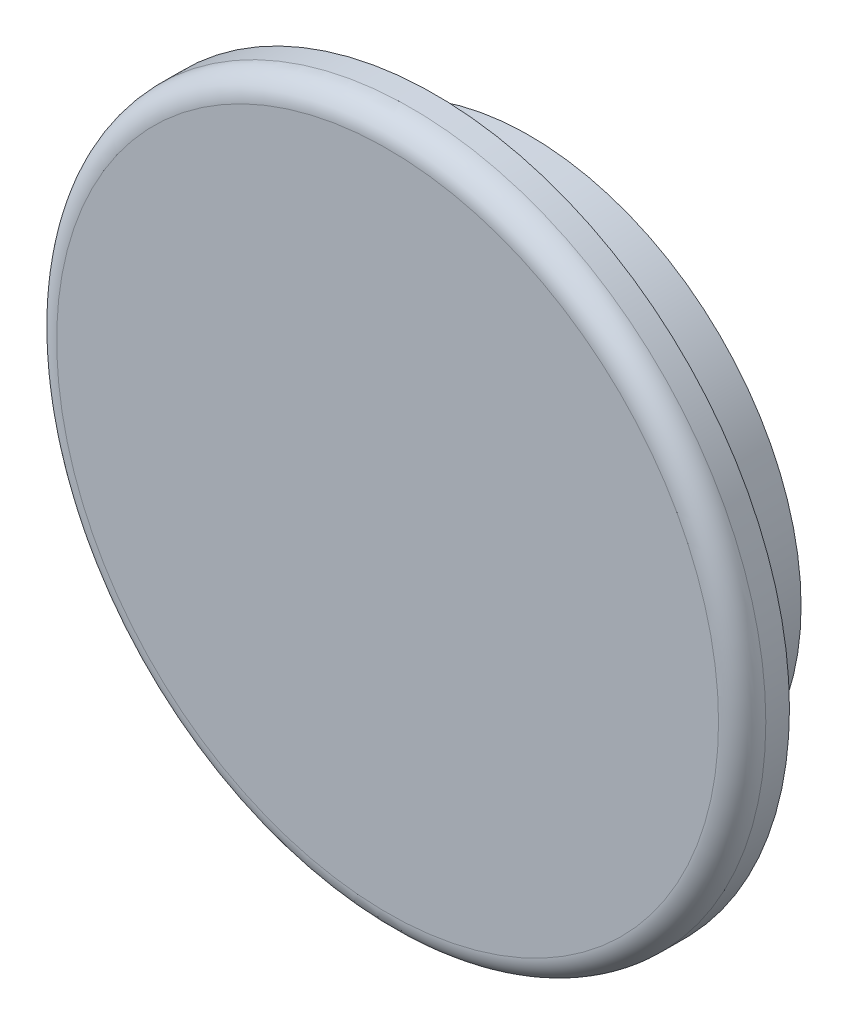
ISO-10303-21;
HEADER;
FILE_DESCRIPTION(('STEP AP214'),'2;1');
FILE_NAME('part.step','',(''),(''),'','','');
FILE_SCHEMA(('AUTOMOTIVE_DESIGN { 1 0 10303 214 1 1 1 1 }'));
ENDSEC;
DATA;
#1=APPLICATION_CONTEXT('core data for automotive mechanical design processes');
#2=APPLICATION_PROTOCOL_DEFINITION('international standard','automotive_design',2000,#1);
#3=PRODUCT_CONTEXT('',#1,'mechanical');
#4=PRODUCT('Part','Part','',(#3));
#5=PRODUCT_RELATED_PRODUCT_CATEGORY('part','',(#4));
#6=PRODUCT_DEFINITION_FORMATION('','',#4);
#7=PRODUCT_DEFINITION_CONTEXT('part definition',#1,'design');
#8=PRODUCT_DEFINITION('design','',#6,#7);
#9=PRODUCT_DEFINITION_SHAPE('','',#8);
#10=(LENGTH_UNIT() NAMED_UNIT(*) SI_UNIT(.MILLI.,.METRE.));
#11=(NAMED_UNIT(*) PLANE_ANGLE_UNIT() SI_UNIT($,.RADIAN.));
#12=(NAMED_UNIT(*) SI_UNIT($,.STERADIAN.) SOLID_ANGLE_UNIT());
#13=UNCERTAINTY_MEASURE_WITH_UNIT(LENGTH_MEASURE(1.E-05),#10,'distance_accuracy_value','');
#14=(GEOMETRIC_REPRESENTATION_CONTEXT(3) GLOBAL_UNCERTAINTY_ASSIGNED_CONTEXT((#13)) GLOBAL_UNIT_ASSIGNED_CONTEXT((#10,
#11,#12)) REPRESENTATION_CONTEXT('',''));
#15=CARTESIAN_POINT('',(0.,0.,0.));
#16=DIRECTION('',(0.,0.,1.));
#17=DIRECTION('',(1.,0.,0.));
#18=AXIS2_PLACEMENT_3D('',#15,#16,#17);
#19=CARTESIAN_POINT('',(0.,0.,2.));
#20=DIRECTION('',(0.,0.,-1.));
#21=DIRECTION('',(-1.,0.,0.));
#22=AXIS2_PLACEMENT_3D('',#19,#20,#21);
#23=CYLINDRICAL_SURFACE('',#22,5.746);
#24=CARTESIAN_POINT('',(0.,0.,2.));
#25=DIRECTION('',(0.,0.,1.));
#26=DIRECTION('',(1.,0.,0.));
#27=AXIS2_PLACEMENT_3D('',#24,#25,#26);
#28=CIRCLE('',#27,5.746);
#29=CARTESIAN_POINT('',(5.746,0.,2.));
#30=VERTEX_POINT('',#29);
#31=EDGE_CURVE('E52',#30,#30,#28,.T.);
#32=ORIENTED_EDGE('',*,*,#31,.F.);
#33=EDGE_LOOP('',(#32));
#34=FACE_BOUND('',#33,.T.);
#35=CARTESIAN_POINT('',(0.,0.,0.));
#36=DIRECTION('',(0.,0.,1.));
#37=DIRECTION('',(1.,0.,0.));
#38=AXIS2_PLACEMENT_3D('',#35,#36,#37);
#39=CIRCLE('',#38,5.746);
#40=CARTESIAN_POINT('',(5.746,0.,0.));
#41=VERTEX_POINT('',#40);
#42=EDGE_CURVE('E56',#41,#41,#39,.T.);
#43=ORIENTED_EDGE('',*,*,#42,.T.);
#44=EDGE_LOOP('',(#43));
#45=FACE_BOUND('',#44,.T.);
#46=ADVANCED_FACE('F41',(#34,#45),#23,.T.);
#47=CARTESIAN_POINT('',(0.,0.,0.));
#48=DIRECTION('',(0.,0.,1.));
#49=DIRECTION('',(1.,0.,0.));
#50=AXIS2_PLACEMENT_3D('',#47,#48,#49);
#51=PLANE('',#50);
#52=ORIENTED_EDGE('',*,*,#42,.F.);
#53=EDGE_LOOP('',(#52));
#54=FACE_BOUND('',#53,.T.);
#55=ADVANCED_FACE('F82',(#54),#51,.F.);
#56=CARTESIAN_POINT('',(0.,0.,3.));
#57=DIRECTION('',(0.,0.,-1.));
#58=DIRECTION('',(-1.,0.,0.));
#59=AXIS2_PLACEMENT_3D('',#56,#57,#58);
#60=CYLINDRICAL_SURFACE('',#59,7.5);
#61=CARTESIAN_POINT('',(0.,0.,2.5));
#62=DIRECTION('',(0.,0.,1.));
#63=DIRECTION('',(1.,0.,0.));
#64=AXIS2_PLACEMENT_3D('',#61,#62,#63);
#65=CIRCLE('',#64,7.5);
#66=CARTESIAN_POINT('',(7.5,0.,2.5));
#67=VERTEX_POINT('',#66);
#68=EDGE_CURVE('E10',#67,#67,#65,.F.);
#69=ORIENTED_EDGE('',*,*,#68,.T.);
#70=EDGE_LOOP('',(#69));
#71=FACE_BOUND('',#70,.T.);
#72=CARTESIAN_POINT('',(0.,0.,2.));
#73=DIRECTION('',(0.,0.,1.));
#74=DIRECTION('',(1.,0.,0.));
#75=AXIS2_PLACEMENT_3D('',#72,#73,#74);
#76=CIRCLE('',#75,7.5);
#77=CARTESIAN_POINT('',(7.5,0.,2.));
#78=VERTEX_POINT('',#77);
#79=EDGE_CURVE('E60',#78,#78,#76,.T.);
#80=ORIENTED_EDGE('',*,*,#79,.T.);
#81=EDGE_LOOP('',(#80));
#82=FACE_BOUND('',#81,.T.);
#83=ADVANCED_FACE('F65',(#71,#82),#60,.T.);
#84=CARTESIAN_POINT('',(0.,0.,3.));
#85=DIRECTION('',(0.,0.,1.));
#86=DIRECTION('',(1.,0.,0.));
#87=AXIS2_PLACEMENT_3D('',#84,#85,#86);
#88=PLANE('',#87);
#89=CARTESIAN_POINT('',(0.,0.,3.));
#90=DIRECTION('',(0.,0.,1.));
#91=DIRECTION('',(1.,0.,0.));
#92=AXIS2_PLACEMENT_3D('',#89,#90,#91);
#93=CIRCLE('',#92,7.);
#94=CARTESIAN_POINT('',(7.,0.,3.));
#95=VERTEX_POINT('',#94);
#96=EDGE_CURVE('E48',#95,#95,#93,.T.);
#97=ORIENTED_EDGE('',*,*,#96,.T.);
#98=EDGE_LOOP('',(#97));
#99=FACE_BOUND('',#98,.T.);
#100=ADVANCED_FACE('F69',(#99),#88,.T.);
#101=CARTESIAN_POINT('',(0.,0.,2.));
#102=DIRECTION('',(0.,0.,1.));
#103=DIRECTION('',(1.,0.,0.));
#104=AXIS2_PLACEMENT_3D('',#101,#102,#103);
#105=PLANE('',#104);
#106=ORIENTED_EDGE('',*,*,#31,.T.);
#107=EDGE_LOOP('',(#106));
#108=FACE_BOUND('',#107,.T.);
#109=ORIENTED_EDGE('',*,*,#79,.F.);
#110=EDGE_LOOP('',(#109));
#111=FACE_BOUND('',#110,.T.);
#112=ADVANCED_FACE('F67',(#108,#111),#105,.F.);
#113=CARTESIAN_POINT('',(0.,0.,2.5));
#114=DIRECTION('',(0.,0.,1.));
#115=DIRECTION('',(1.,0.,0.));
#116=AXIS2_PLACEMENT_3D('',#113,#114,#115);
#117=TOROIDAL_SURFACE('',#116,7.,0.5);
#118=ORIENTED_EDGE('',*,*,#68,.F.);
#119=EDGE_LOOP('',(#118));
#120=FACE_BOUND('',#119,.T.);
#121=ORIENTED_EDGE('',*,*,#96,.F.);
#122=EDGE_LOOP('',(#121));
#123=FACE_BOUND('',#122,.T.);
#124=ADVANCED_FACE('F43',(#120,#123),#117,.T.);
#125=CLOSED_SHELL('',(#46,#55,#83,#100,#112,#124));
#126=MANIFOLD_SOLID_BREP('B2',#125);
#127=ADVANCED_BREP_SHAPE_REPRESENTATION('',(#18,#126),#14);
#128=SHAPE_DEFINITION_REPRESENTATION(#9,#127);
ENDSEC;
END-ISO-10303-21;
